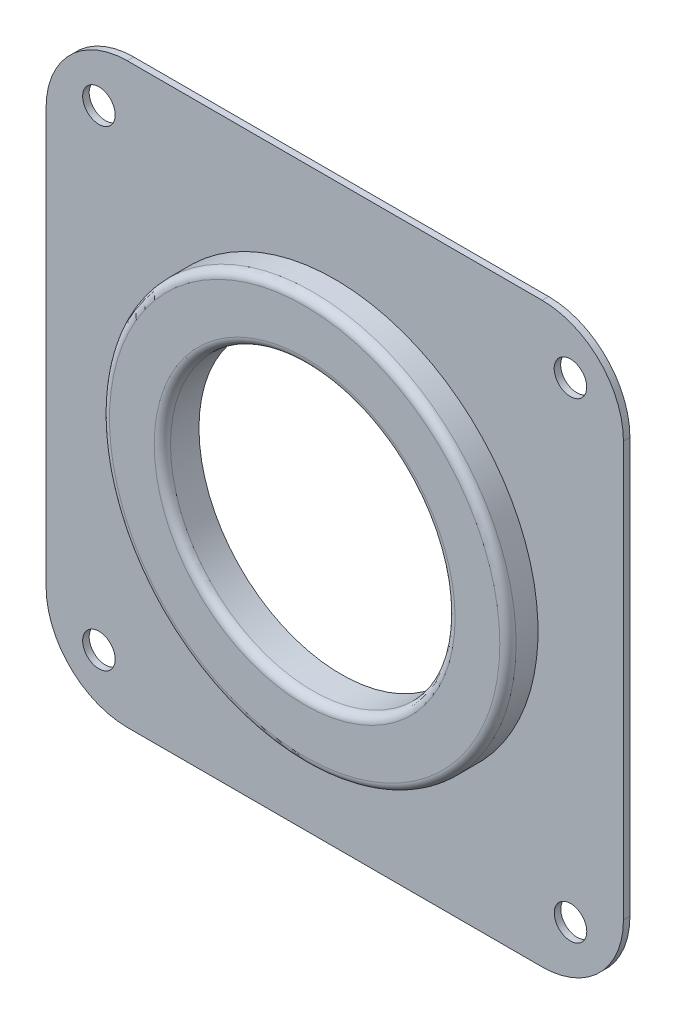
ISO-10303-21;
HEADER;
FILE_DESCRIPTION(('STEP AP214'),'2;1');
FILE_NAME('part.step','',(''),(''),'','','');
FILE_SCHEMA(('AUTOMOTIVE_DESIGN { 1 0 10303 214 1 1 1 1 }'));
ENDSEC;
DATA;
#1=APPLICATION_CONTEXT('core data for automotive mechanical design processes');
#2=APPLICATION_PROTOCOL_DEFINITION('international standard','automotive_design',2000,#1);
#3=PRODUCT_CONTEXT('',#1,'mechanical');
#4=PRODUCT('Part','Part','',(#3));
#5=PRODUCT_RELATED_PRODUCT_CATEGORY('part','',(#4));
#6=PRODUCT_DEFINITION_FORMATION('','',#4);
#7=PRODUCT_DEFINITION_CONTEXT('part definition',#1,'design');
#8=PRODUCT_DEFINITION('design','',#6,#7);
#9=PRODUCT_DEFINITION_SHAPE('','',#8);
#10=(LENGTH_UNIT() NAMED_UNIT(*) SI_UNIT(.MILLI.,.METRE.));
#11=(NAMED_UNIT(*) PLANE_ANGLE_UNIT() SI_UNIT($,.RADIAN.));
#12=(NAMED_UNIT(*) SI_UNIT($,.STERADIAN.) SOLID_ANGLE_UNIT());
#13=UNCERTAINTY_MEASURE_WITH_UNIT(LENGTH_MEASURE(1.E-05),#10,'distance_accuracy_value','');
#14=(GEOMETRIC_REPRESENTATION_CONTEXT(3) GLOBAL_UNCERTAINTY_ASSIGNED_CONTEXT((#13)) GLOBAL_UNIT_ASSIGNED_CONTEXT((#10,
#11,#12)) REPRESENTATION_CONTEXT('',''));
#15=CARTESIAN_POINT('',(0.,0.,0.));
#16=DIRECTION('',(0.,0.,1.));
#17=DIRECTION('',(1.,0.,0.));
#18=AXIS2_PLACEMENT_3D('',#15,#16,#17);
#19=CARTESIAN_POINT('',(35.5,35.5,0.2));
#20=DIRECTION('',(0.,1.,0.));
#21=DIRECTION('',(0.,0.,1.));
#22=AXIS2_PLACEMENT_3D('',#19,#20,#21);
#23=PLANE('',#22);
#24=DIRECTION('',(-1.,0.,0.));
#25=VECTOR('',#24,1.);
#26=CARTESIAN_POINT('',(35.5,35.5,0.2));
#27=LINE('',#26,#25);
#28=CARTESIAN_POINT('',(25.5,35.5,0.2));
#29=VERTEX_POINT('',#28);
#30=CARTESIAN_POINT('',(-25.5,35.5,0.2));
#31=VERTEX_POINT('',#30);
#32=EDGE_CURVE('E154',#29,#31,#27,.T.);
#33=ORIENTED_EDGE('',*,*,#32,.T.);
#34=DIRECTION('',(0.,0.,1.));
#35=VECTOR('',#34,1.);
#36=CARTESIAN_POINT('',(-25.5,35.5,0.2));
#37=LINE('',#36,#35);
#38=CARTESIAN_POINT('',(-25.5,35.5,1.));
#39=VERTEX_POINT('',#38);
#40=EDGE_CURVE('E11',#31,#39,#37,.T.);
#41=ORIENTED_EDGE('',*,*,#40,.T.);
#42=DIRECTION('',(-1.,0.,0.));
#43=VECTOR('',#42,1.);
#44=CARTESIAN_POINT('',(35.5,35.5,1.));
#45=LINE('',#44,#43);
#46=CARTESIAN_POINT('',(25.5,35.5,1.));
#47=VERTEX_POINT('',#46);
#48=EDGE_CURVE('E157',#47,#39,#45,.T.);
#49=ORIENTED_EDGE('',*,*,#48,.F.);
#50=DIRECTION('',(0.,0.,1.));
#51=VECTOR('',#50,1.);
#52=CARTESIAN_POINT('',(25.5,35.5,0.2));
#53=LINE('',#52,#51);
#54=EDGE_CURVE('E42',#47,#29,#53,.F.);
#55=ORIENTED_EDGE('',*,*,#54,.T.);
#56=EDGE_LOOP('',(#33,#41,#49,#55));
#57=FACE_BOUND('',#56,.T.);
#58=ADVANCED_FACE('F34',(#57),#23,.T.);
#59=CARTESIAN_POINT('',(35.5,-35.5,0.2));
#60=DIRECTION('',(1.,0.,0.));
#61=DIRECTION('',(0.,0.,-1.));
#62=AXIS2_PLACEMENT_3D('',#59,#60,#61);
#63=PLANE('',#62);
#64=DIRECTION('',(0.,1.,0.));
#65=VECTOR('',#64,1.);
#66=CARTESIAN_POINT('',(35.5,-35.5,1.));
#67=LINE('',#66,#65);
#68=CARTESIAN_POINT('',(35.5,-25.5,1.));
#69=VERTEX_POINT('',#68);
#70=CARTESIAN_POINT('',(35.5,25.5,1.));
#71=VERTEX_POINT('',#70);
#72=EDGE_CURVE('E120',#69,#71,#67,.T.);
#73=ORIENTED_EDGE('',*,*,#72,.F.);
#74=DIRECTION('',(0.,0.,1.));
#75=VECTOR('',#74,1.);
#76=CARTESIAN_POINT('',(35.5,-25.5,0.2));
#77=LINE('',#76,#75);
#78=CARTESIAN_POINT('',(35.5,-25.5,0.2));
#79=VERTEX_POINT('',#78);
#80=EDGE_CURVE('E138',#69,#79,#77,.F.);
#81=ORIENTED_EDGE('',*,*,#80,.T.);
#82=DIRECTION('',(0.,1.,0.));
#83=VECTOR('',#82,1.);
#84=CARTESIAN_POINT('',(35.5,-35.5,0.2));
#85=LINE('',#84,#83);
#86=CARTESIAN_POINT('',(35.5,25.5,0.2));
#87=VERTEX_POINT('',#86);
#88=EDGE_CURVE('E172',#79,#87,#85,.T.);
#89=ORIENTED_EDGE('',*,*,#88,.T.);
#90=DIRECTION('',(0.,0.,1.));
#91=VECTOR('',#90,1.);
#92=CARTESIAN_POINT('',(35.5,25.5,0.2));
#93=LINE('',#92,#91);
#94=EDGE_CURVE('E135',#87,#71,#93,.T.);
#95=ORIENTED_EDGE('',*,*,#94,.T.);
#96=EDGE_LOOP('',(#73,#81,#89,#95));
#97=FACE_BOUND('',#96,.T.);
#98=ADVANCED_FACE('F170',(#97),#63,.T.);
#99=CARTESIAN_POINT('',(-35.5,-35.5,0.2));
#100=DIRECTION('',(0.,-1.,0.));
#101=DIRECTION('',(1.,0.,0.));
#102=AXIS2_PLACEMENT_3D('',#99,#100,#101);
#103=PLANE('',#102);
#104=DIRECTION('',(1.,0.,0.));
#105=VECTOR('',#104,1.);
#106=CARTESIAN_POINT('',(-35.5,-35.5,0.2));
#107=LINE('',#106,#105);
#108=CARTESIAN_POINT('',(-25.5,-35.5,0.2));
#109=VERTEX_POINT('',#108);
#110=CARTESIAN_POINT('',(25.5,-35.5,0.2));
#111=VERTEX_POINT('',#110);
#112=EDGE_CURVE('E215',#109,#111,#107,.T.);
#113=ORIENTED_EDGE('',*,*,#112,.T.);
#114=DIRECTION('',(0.,0.,1.));
#115=VECTOR('',#114,1.);
#116=CARTESIAN_POINT('',(25.5,-35.5,0.2));
#117=LINE('',#116,#115);
#118=CARTESIAN_POINT('',(25.5,-35.5,1.));
#119=VERTEX_POINT('',#118);
#120=EDGE_CURVE('E119',#111,#119,#117,.T.);
#121=ORIENTED_EDGE('',*,*,#120,.T.);
#122=DIRECTION('',(1.,0.,0.));
#123=VECTOR('',#122,1.);
#124=CARTESIAN_POINT('',(-35.5,-35.5,1.));
#125=LINE('',#124,#123);
#126=CARTESIAN_POINT('',(-25.5,-35.5,1.));
#127=VERTEX_POINT('',#126);
#128=EDGE_CURVE('E104',#127,#119,#125,.T.);
#129=ORIENTED_EDGE('',*,*,#128,.F.);
#130=DIRECTION('',(0.,0.,1.));
#131=VECTOR('',#130,1.);
#132=CARTESIAN_POINT('',(-25.5,-35.5,0.2));
#133=LINE('',#132,#131);
#134=EDGE_CURVE('E117',#127,#109,#133,.F.);
#135=ORIENTED_EDGE('',*,*,#134,.T.);
#136=EDGE_LOOP('',(#113,#121,#129,#135));
#137=FACE_BOUND('',#136,.T.);
#138=ADVANCED_FACE('F116',(#137),#103,.T.);
#139=CARTESIAN_POINT('',(-35.5,35.5,0.2));
#140=DIRECTION('',(-1.,0.,0.));
#141=DIRECTION('',(0.,0.,1.));
#142=AXIS2_PLACEMENT_3D('',#139,#140,#141);
#143=PLANE('',#142);
#144=DIRECTION('',(0.,-1.,0.));
#145=VECTOR('',#144,1.);
#146=CARTESIAN_POINT('',(-35.5,35.5,0.2));
#147=LINE('',#146,#145);
#148=CARTESIAN_POINT('',(-35.5,25.5,0.2));
#149=VERTEX_POINT('',#148);
#150=CARTESIAN_POINT('',(-35.5,-25.5,0.2));
#151=VERTEX_POINT('',#150);
#152=EDGE_CURVE('E164',#149,#151,#147,.T.);
#153=ORIENTED_EDGE('',*,*,#152,.T.);
#154=DIRECTION('',(0.,0.,1.));
#155=VECTOR('',#154,1.);
#156=CARTESIAN_POINT('',(-35.5,-25.5,0.2));
#157=LINE('',#156,#155);
#158=CARTESIAN_POINT('',(-35.5,-25.5,1.));
#159=VERTEX_POINT('',#158);
#160=EDGE_CURVE('E148',#151,#159,#157,.T.);
#161=ORIENTED_EDGE('',*,*,#160,.T.);
#162=DIRECTION('',(0.,-1.,0.));
#163=VECTOR('',#162,1.);
#164=CARTESIAN_POINT('',(-35.5,35.5,1.));
#165=LINE('',#164,#163);
#166=CARTESIAN_POINT('',(-35.5,25.5,1.));
#167=VERTEX_POINT('',#166);
#168=EDGE_CURVE('E105',#167,#159,#165,.T.);
#169=ORIENTED_EDGE('',*,*,#168,.F.);
#170=DIRECTION('',(0.,0.,1.));
#171=VECTOR('',#170,1.);
#172=CARTESIAN_POINT('',(-35.5,25.5,0.2));
#173=LINE('',#172,#171);
#174=EDGE_CURVE('E56',#167,#149,#173,.F.);
#175=ORIENTED_EDGE('',*,*,#174,.T.);
#176=EDGE_LOOP('',(#153,#161,#169,#175));
#177=FACE_BOUND('',#176,.T.);
#178=ADVANCED_FACE('F219',(#177),#143,.T.);
#179=CARTESIAN_POINT('',(0.,0.,0.2));
#180=DIRECTION('',(0.,0.,1.));
#181=DIRECTION('',(1.,0.,0.));
#182=AXIS2_PLACEMENT_3D('',#179,#180,#181);
#183=PLANE('',#182);
#184=CARTESIAN_POINT('',(-29.,28.98,0.2));
#185=DIRECTION('',(0.,0.,1.));
#186=DIRECTION('',(1.,0.,0.));
#187=AXIS2_PLACEMENT_3D('',#184,#185,#186);
#188=CIRCLE('',#187,2.);
#189=CARTESIAN_POINT('',(-27.,28.98,0.2));
#190=VERTEX_POINT('',#189);
#191=EDGE_CURVE('E384',#190,#190,#188,.T.);
#192=ORIENTED_EDGE('',*,*,#191,.T.);
#193=EDGE_LOOP('',(#192));
#194=FACE_BOUND('',#193,.T.);
#195=CARTESIAN_POINT('',(-29.,-29.,0.2));
#196=DIRECTION('',(0.,0.,1.));
#197=DIRECTION('',(1.,0.,0.));
#198=AXIS2_PLACEMENT_3D('',#195,#196,#197);
#199=CIRCLE('',#198,2.);
#200=CARTESIAN_POINT('',(-27.,-29.,0.2));
#201=VERTEX_POINT('',#200);
#202=EDGE_CURVE('E388',#201,#201,#199,.T.);
#203=ORIENTED_EDGE('',*,*,#202,.T.);
#204=EDGE_LOOP('',(#203));
#205=FACE_BOUND('',#204,.T.);
#206=CARTESIAN_POINT('',(28.9927539458673,-28.9927564445067,0.2));
#207=DIRECTION('',(0.,0.,1.));
#208=DIRECTION('',(1.,0.,0.));
#209=AXIS2_PLACEMENT_3D('',#206,#207,#208);
#210=CIRCLE('',#209,2.);
#211=CARTESIAN_POINT('',(30.9927539458673,-28.9927564445067,0.2));
#212=VERTEX_POINT('',#211);
#213=EDGE_CURVE('E392',#212,#212,#210,.T.);
#214=ORIENTED_EDGE('',*,*,#213,.T.);
#215=EDGE_LOOP('',(#214));
#216=FACE_BOUND('',#215,.T.);
#217=CARTESIAN_POINT('',(28.9827560572969,28.9827560572969,0.2));
#218=DIRECTION('',(0.,0.,1.));
#219=DIRECTION('',(1.,0.,0.));
#220=AXIS2_PLACEMENT_3D('',#217,#218,#219);
#221=CIRCLE('',#220,2.);
#222=CARTESIAN_POINT('',(30.9827560572969,28.9827560572969,0.2));
#223=VERTEX_POINT('',#222);
#224=EDGE_CURVE('E205',#223,#223,#221,.T.);
#225=ORIENTED_EDGE('',*,*,#224,.T.);
#226=EDGE_LOOP('',(#225));
#227=FACE_BOUND('',#226,.T.);
#228=CARTESIAN_POINT('',(0.,0.,0.200000000000002));
#229=DIRECTION('',(0.,0.,1.));
#230=DIRECTION('',(1.,0.,0.));
#231=AXIS2_PLACEMENT_3D('',#228,#229,#230);
#232=CIRCLE('',#231,17.5);
#233=CARTESIAN_POINT('',(17.5,0.,0.200000000000002));
#234=VERTEX_POINT('',#233);
#235=EDGE_CURVE('E202',#234,#234,#232,.T.);
#236=ORIENTED_EDGE('',*,*,#235,.T.);
#237=EDGE_LOOP('',(#236));
#238=FACE_BOUND('',#237,.T.);
#239=ORIENTED_EDGE('',*,*,#88,.F.);
#240=CARTESIAN_POINT('',(25.5,-25.5,0.2));
#241=DIRECTION('',(0.,0.,1.));
#242=DIRECTION('',(1.,0.,0.));
#243=AXIS2_PLACEMENT_3D('',#240,#241,#242);
#244=CIRCLE('',#243,10.);
#245=EDGE_CURVE('E145',#79,#111,#244,.F.);
#246=ORIENTED_EDGE('',*,*,#245,.T.);
#247=ORIENTED_EDGE('',*,*,#112,.F.);
#248=CARTESIAN_POINT('',(-25.5,-25.5,0.2));
#249=DIRECTION('',(0.,0.,1.));
#250=DIRECTION('',(1.,0.,0.));
#251=AXIS2_PLACEMENT_3D('',#248,#249,#250);
#252=CIRCLE('',#251,10.);
#253=EDGE_CURVE('E49',#109,#151,#252,.F.);
#254=ORIENTED_EDGE('',*,*,#253,.T.);
#255=ORIENTED_EDGE('',*,*,#152,.F.);
#256=CARTESIAN_POINT('',(-25.5,25.5,0.2));
#257=DIRECTION('',(0.,0.,1.));
#258=DIRECTION('',(1.,0.,0.));
#259=AXIS2_PLACEMENT_3D('',#256,#257,#258);
#260=CIRCLE('',#259,10.);
#261=EDGE_CURVE('E142',#149,#31,#260,.F.);
#262=ORIENTED_EDGE('',*,*,#261,.T.);
#263=ORIENTED_EDGE('',*,*,#32,.F.);
#264=CARTESIAN_POINT('',(25.5,25.5,0.2));
#265=DIRECTION('',(0.,0.,1.));
#266=DIRECTION('',(1.,0.,0.));
#267=AXIS2_PLACEMENT_3D('',#264,#265,#266);
#268=CIRCLE('',#267,10.);
#269=EDGE_CURVE('E140',#29,#87,#268,.F.);
#270=ORIENTED_EDGE('',*,*,#269,.T.);
#271=EDGE_LOOP('',(#239,#246,#247,#254,#255,#262,#263,#270));
#272=FACE_BOUND('',#271,.T.);
#273=ADVANCED_FACE('F161',(#194,#205,#216,#227,#238,#272),#183,.F.);
#274=CARTESIAN_POINT('',(0.,0.,1.));
#275=DIRECTION('',(0.,0.,1.));
#276=DIRECTION('',(1.,0.,0.));
#277=AXIS2_PLACEMENT_3D('',#274,#275,#276);
#278=PLANE('',#277);
#279=CARTESIAN_POINT('',(-29.,28.98,1.));
#280=DIRECTION('',(0.,0.,1.));
#281=DIRECTION('',(1.,0.,0.));
#282=AXIS2_PLACEMENT_3D('',#279,#280,#281);
#283=CIRCLE('',#282,1.99999999999999);
#284=CARTESIAN_POINT('',(-27.,28.98,1.));
#285=VERTEX_POINT('',#284);
#286=EDGE_CURVE('E408',#285,#285,#283,.T.);
#287=ORIENTED_EDGE('',*,*,#286,.F.);
#288=EDGE_LOOP('',(#287));
#289=FACE_BOUND('',#288,.T.);
#290=CARTESIAN_POINT('',(-29.,-29.,1.));
#291=DIRECTION('',(0.,0.,1.));
#292=DIRECTION('',(1.,0.,0.));
#293=AXIS2_PLACEMENT_3D('',#290,#291,#292);
#294=CIRCLE('',#293,1.99999999999999);
#295=CARTESIAN_POINT('',(-27.,-29.,1.));
#296=VERTEX_POINT('',#295);
#297=EDGE_CURVE('E404',#296,#296,#294,.T.);
#298=ORIENTED_EDGE('',*,*,#297,.F.);
#299=EDGE_LOOP('',(#298));
#300=FACE_BOUND('',#299,.T.);
#301=CARTESIAN_POINT('',(28.9927539458673,-28.9927564445067,1.));
#302=DIRECTION('',(0.,0.,1.));
#303=DIRECTION('',(1.,0.,0.));
#304=AXIS2_PLACEMENT_3D('',#301,#302,#303);
#305=CIRCLE('',#304,1.99999999999999);
#306=CARTESIAN_POINT('',(30.9927539458673,-28.9927564445067,1.));
#307=VERTEX_POINT('',#306);
#308=EDGE_CURVE('E398',#307,#307,#305,.T.);
#309=ORIENTED_EDGE('',*,*,#308,.F.);
#310=EDGE_LOOP('',(#309));
#311=FACE_BOUND('',#310,.T.);
#312=CARTESIAN_POINT('',(28.9827560572969,28.9827560572969,1.));
#313=DIRECTION('',(0.,0.,1.));
#314=DIRECTION('',(1.,0.,0.));
#315=AXIS2_PLACEMENT_3D('',#312,#313,#314);
#316=CIRCLE('',#315,1.99999999999999);
#317=CARTESIAN_POINT('',(30.9827560572969,28.9827560572969,1.));
#318=VERTEX_POINT('',#317);
#319=EDGE_CURVE('E210',#318,#318,#316,.T.);
#320=ORIENTED_EDGE('',*,*,#319,.F.);
#321=EDGE_LOOP('',(#320));
#322=FACE_BOUND('',#321,.T.);
#323=CARTESIAN_POINT('',(0.,0.,1.));
#324=DIRECTION('',(0.,0.,-1.));
#325=DIRECTION('',(-1.,0.,0.));
#326=AXIS2_PLACEMENT_3D('',#323,#324,#325);
#327=CIRCLE('',#326,25.);
#328=CARTESIAN_POINT('',(-25.,0.,1.));
#329=VERTEX_POINT('',#328);
#330=EDGE_CURVE('E204',#329,#329,#327,.T.);
#331=ORIENTED_EDGE('',*,*,#330,.T.);
#332=EDGE_LOOP('',(#331));
#333=FACE_BOUND('',#332,.T.);
#334=ORIENTED_EDGE('',*,*,#128,.T.);
#335=CARTESIAN_POINT('',(25.5,-25.5,1.));
#336=DIRECTION('',(0.,0.,1.));
#337=DIRECTION('',(1.,0.,0.));
#338=AXIS2_PLACEMENT_3D('',#335,#336,#337);
#339=CIRCLE('',#338,10.);
#340=EDGE_CURVE('E110',#119,#69,#339,.T.);
#341=ORIENTED_EDGE('',*,*,#340,.T.);
#342=ORIENTED_EDGE('',*,*,#72,.T.);
#343=CARTESIAN_POINT('',(25.5,25.5,1.));
#344=DIRECTION('',(0.,0.,1.));
#345=DIRECTION('',(1.,0.,0.));
#346=AXIS2_PLACEMENT_3D('',#343,#344,#345);
#347=CIRCLE('',#346,10.);
#348=EDGE_CURVE('E125',#71,#47,#347,.T.);
#349=ORIENTED_EDGE('',*,*,#348,.T.);
#350=ORIENTED_EDGE('',*,*,#48,.T.);
#351=CARTESIAN_POINT('',(-25.5,25.5,1.));
#352=DIRECTION('',(0.,0.,1.));
#353=DIRECTION('',(1.,0.,0.));
#354=AXIS2_PLACEMENT_3D('',#351,#352,#353);
#355=CIRCLE('',#354,10.);
#356=EDGE_CURVE('E111',#39,#167,#355,.T.);
#357=ORIENTED_EDGE('',*,*,#356,.T.);
#358=ORIENTED_EDGE('',*,*,#168,.T.);
#359=CARTESIAN_POINT('',(-25.5,-25.5,1.));
#360=DIRECTION('',(0.,0.,1.));
#361=DIRECTION('',(1.,0.,0.));
#362=AXIS2_PLACEMENT_3D('',#359,#360,#361);
#363=CIRCLE('',#362,10.);
#364=EDGE_CURVE('E101',#159,#127,#363,.T.);
#365=ORIENTED_EDGE('',*,*,#364,.T.);
#366=EDGE_LOOP('',(#334,#341,#342,#349,#350,#357,#358,#365));
#367=FACE_BOUND('',#366,.T.);
#368=ADVANCED_FACE('F103',(#289,#300,#311,#322,#333,#367),#278,.T.);
#369=CARTESIAN_POINT('',(0.,0.,4.7));
#370=DIRECTION('',(0.,0.,-1.));
#371=DIRECTION('',(-1.,0.,0.));
#372=AXIS2_PLACEMENT_3D('',#369,#370,#371);
#373=CYLINDRICAL_SURFACE('',#372,25.);
#374=CARTESIAN_POINT('',(0.,0.,3.7));
#375=DIRECTION('',(0.,0.,1.));
#376=DIRECTION('',(1.,0.,0.));
#377=AXIS2_PLACEMENT_3D('',#374,#375,#376);
#378=CIRCLE('',#377,25.);
#379=CARTESIAN_POINT('',(25.,0.,3.7));
#380=VERTEX_POINT('',#379);
#381=EDGE_CURVE('E123',#380,#380,#378,.F.);
#382=ORIENTED_EDGE('',*,*,#381,.T.);
#383=EDGE_LOOP('',(#382));
#384=FACE_BOUND('',#383,.T.);
#385=ORIENTED_EDGE('',*,*,#330,.F.);
#386=EDGE_LOOP('',(#385));
#387=FACE_BOUND('',#386,.T.);
#388=ADVANCED_FACE('F323',(#384,#387),#373,.T.);
#389=CARTESIAN_POINT('',(25.,0.,4.7));
#390=DIRECTION('',(0.,0.,1.));
#391=DIRECTION('',(1.,0.,0.));
#392=AXIS2_PLACEMENT_3D('',#389,#390,#391);
#393=PLANE('',#392);
#394=CARTESIAN_POINT('',(0.,0.,4.7));
#395=DIRECTION('',(0.,0.,1.));
#396=DIRECTION('',(1.,0.,0.));
#397=AXIS2_PLACEMENT_3D('',#394,#395,#396);
#398=CIRCLE('',#397,18.5);
#399=CARTESIAN_POINT('',(18.5,0.,4.7));
#400=VERTEX_POINT('',#399);
#401=EDGE_CURVE('E128',#400,#400,#398,.F.);
#402=ORIENTED_EDGE('',*,*,#401,.T.);
#403=EDGE_LOOP('',(#402));
#404=FACE_BOUND('',#403,.T.);
#405=CARTESIAN_POINT('',(0.,0.,4.7));
#406=DIRECTION('',(0.,0.,1.));
#407=DIRECTION('',(1.,0.,0.));
#408=AXIS2_PLACEMENT_3D('',#405,#406,#407);
#409=CIRCLE('',#408,24.);
#410=CARTESIAN_POINT('',(24.,0.,4.7));
#411=VERTEX_POINT('',#410);
#412=EDGE_CURVE('E179',#411,#411,#409,.T.);
#413=ORIENTED_EDGE('',*,*,#412,.T.);
#414=EDGE_LOOP('',(#413));
#415=FACE_BOUND('',#414,.T.);
#416=ADVANCED_FACE('F184',(#404,#415),#393,.T.);
#417=CARTESIAN_POINT('',(0.,0.,4.7));
#418=DIRECTION('',(0.,0.,1.));
#419=DIRECTION('',(1.,0.,0.));
#420=AXIS2_PLACEMENT_3D('',#417,#418,#419);
#421=CYLINDRICAL_SURFACE('',#420,17.5);
#422=CARTESIAN_POINT('',(0.,0.,3.7));
#423=DIRECTION('',(0.,0.,1.));
#424=DIRECTION('',(1.,0.,0.));
#425=AXIS2_PLACEMENT_3D('',#422,#423,#424);
#426=CIRCLE('',#425,17.5);
#427=CARTESIAN_POINT('',(17.5,0.,3.7));
#428=VERTEX_POINT('',#427);
#429=EDGE_CURVE('E176',#428,#428,#426,.T.);
#430=ORIENTED_EDGE('',*,*,#429,.T.);
#431=EDGE_LOOP('',(#430));
#432=FACE_BOUND('',#431,.T.);
#433=ORIENTED_EDGE('',*,*,#235,.F.);
#434=EDGE_LOOP('',(#433));
#435=FACE_BOUND('',#434,.T.);
#436=ADVANCED_FACE('F195',(#432,#435),#421,.F.);
#437=CARTESIAN_POINT('',(28.9827560572969,28.9827560572969,1.));
#438=DIRECTION('',(0.,0.,1.));
#439=DIRECTION('',(1.,0.,0.));
#440=AXIS2_PLACEMENT_3D('',#437,#438,#439);
#441=CYLINDRICAL_SURFACE('',#440,1.99999999999999);
#442=ORIENTED_EDGE('',*,*,#224,.F.);
#443=EDGE_LOOP('',(#442));
#444=FACE_BOUND('',#443,.T.);
#445=ORIENTED_EDGE('',*,*,#319,.T.);
#446=EDGE_LOOP('',(#445));
#447=FACE_BOUND('',#446,.T.);
#448=ADVANCED_FACE('F198',(#444,#447),#441,.F.);
#449=CARTESIAN_POINT('',(28.9927539458673,-28.9927564445067,1.));
#450=DIRECTION('',(0.,0.,1.));
#451=DIRECTION('',(1.,0.,0.));
#452=AXIS2_PLACEMENT_3D('',#449,#450,#451);
#453=CYLINDRICAL_SURFACE('',#452,1.99999999999999);
#454=ORIENTED_EDGE('',*,*,#213,.F.);
#455=EDGE_LOOP('',(#454));
#456=FACE_BOUND('',#455,.T.);
#457=ORIENTED_EDGE('',*,*,#308,.T.);
#458=EDGE_LOOP('',(#457));
#459=FACE_BOUND('',#458,.T.);
#460=ADVANCED_FACE('F294',(#456,#459),#453,.F.);
#461=CARTESIAN_POINT('',(-29.,-29.,1.));
#462=DIRECTION('',(0.,0.,1.));
#463=DIRECTION('',(1.,0.,0.));
#464=AXIS2_PLACEMENT_3D('',#461,#462,#463);
#465=CYLINDRICAL_SURFACE('',#464,1.99999999999999);
#466=ORIENTED_EDGE('',*,*,#202,.F.);
#467=EDGE_LOOP('',(#466));
#468=FACE_BOUND('',#467,.T.);
#469=ORIENTED_EDGE('',*,*,#297,.T.);
#470=EDGE_LOOP('',(#469));
#471=FACE_BOUND('',#470,.T.);
#472=ADVANCED_FACE('F284',(#468,#471),#465,.F.);
#473=CARTESIAN_POINT('',(-29.,28.98,1.));
#474=DIRECTION('',(0.,0.,1.));
#475=DIRECTION('',(1.,0.,0.));
#476=AXIS2_PLACEMENT_3D('',#473,#474,#475);
#477=CYLINDRICAL_SURFACE('',#476,1.99999999999999);
#478=ORIENTED_EDGE('',*,*,#191,.F.);
#479=EDGE_LOOP('',(#478));
#480=FACE_BOUND('',#479,.T.);
#481=ORIENTED_EDGE('',*,*,#286,.T.);
#482=EDGE_LOOP('',(#481));
#483=FACE_BOUND('',#482,.T.);
#484=ADVANCED_FACE('F191',(#480,#483),#477,.F.);
#485=CARTESIAN_POINT('',(0.,0.,3.7));
#486=DIRECTION('',(0.,0.,1.));
#487=DIRECTION('',(1.,0.,0.));
#488=AXIS2_PLACEMENT_3D('',#485,#486,#487);
#489=TOROIDAL_SURFACE('',#488,18.5,1.);
#490=ORIENTED_EDGE('',*,*,#401,.F.);
#491=EDGE_LOOP('',(#490));
#492=FACE_BOUND('',#491,.T.);
#493=ORIENTED_EDGE('',*,*,#429,.F.);
#494=EDGE_LOOP('',(#493));
#495=FACE_BOUND('',#494,.T.);
#496=ADVANCED_FACE('F187',(#492,#495),#489,.T.);
#497=CARTESIAN_POINT('',(0.,0.,3.7));
#498=DIRECTION('',(0.,0.,1.));
#499=DIRECTION('',(1.,0.,0.));
#500=AXIS2_PLACEMENT_3D('',#497,#498,#499);
#501=TOROIDAL_SURFACE('',#500,24.,1.);
#502=ORIENTED_EDGE('',*,*,#412,.F.);
#503=EDGE_LOOP('',(#502));
#504=FACE_BOUND('',#503,.T.);
#505=ORIENTED_EDGE('',*,*,#381,.F.);
#506=EDGE_LOOP('',(#505));
#507=FACE_BOUND('',#506,.T.);
#508=ADVANCED_FACE('F190',(#504,#507),#501,.T.);
#509=CARTESIAN_POINT('',(25.5,-25.5,0.2));
#510=DIRECTION('',(0.,0.,1.));
#511=DIRECTION('',(1.,0.,0.));
#512=AXIS2_PLACEMENT_3D('',#509,#510,#511);
#513=CYLINDRICAL_SURFACE('',#512,10.);
#514=ORIENTED_EDGE('',*,*,#245,.F.);
#515=ORIENTED_EDGE('',*,*,#80,.F.);
#516=ORIENTED_EDGE('',*,*,#340,.F.);
#517=ORIENTED_EDGE('',*,*,#120,.F.);
#518=EDGE_LOOP('',(#514,#515,#516,#517));
#519=FACE_BOUND('',#518,.T.);
#520=ADVANCED_FACE('F226',(#519),#513,.T.);
#521=CARTESIAN_POINT('',(-25.5,-25.5,0.2));
#522=DIRECTION('',(0.,0.,1.));
#523=DIRECTION('',(1.,0.,0.));
#524=AXIS2_PLACEMENT_3D('',#521,#522,#523);
#525=CYLINDRICAL_SURFACE('',#524,10.);
#526=ORIENTED_EDGE('',*,*,#253,.F.);
#527=ORIENTED_EDGE('',*,*,#134,.F.);
#528=ORIENTED_EDGE('',*,*,#364,.F.);
#529=ORIENTED_EDGE('',*,*,#160,.F.);
#530=EDGE_LOOP('',(#526,#527,#528,#529));
#531=FACE_BOUND('',#530,.T.);
#532=ADVANCED_FACE('F122',(#531),#525,.T.);
#533=CARTESIAN_POINT('',(-25.5,25.5,0.2));
#534=DIRECTION('',(0.,0.,1.));
#535=DIRECTION('',(1.,0.,0.));
#536=AXIS2_PLACEMENT_3D('',#533,#534,#535);
#537=CYLINDRICAL_SURFACE('',#536,10.);
#538=ORIENTED_EDGE('',*,*,#261,.F.);
#539=ORIENTED_EDGE('',*,*,#174,.F.);
#540=ORIENTED_EDGE('',*,*,#356,.F.);
#541=ORIENTED_EDGE('',*,*,#40,.F.);
#542=EDGE_LOOP('',(#538,#539,#540,#541));
#543=FACE_BOUND('',#542,.T.);
#544=ADVANCED_FACE('F220',(#543),#537,.T.);
#545=CARTESIAN_POINT('',(25.5,25.5,0.2));
#546=DIRECTION('',(0.,0.,1.));
#547=DIRECTION('',(1.,0.,0.));
#548=AXIS2_PLACEMENT_3D('',#545,#546,#547);
#549=CYLINDRICAL_SURFACE('',#548,10.);
#550=ORIENTED_EDGE('',*,*,#269,.F.);
#551=ORIENTED_EDGE('',*,*,#54,.F.);
#552=ORIENTED_EDGE('',*,*,#348,.F.);
#553=ORIENTED_EDGE('',*,*,#94,.F.);
#554=EDGE_LOOP('',(#550,#551,#552,#553));
#555=FACE_BOUND('',#554,.T.);
#556=ADVANCED_FACE('F36',(#555),#549,.T.);
#557=CLOSED_SHELL('',(#58,#98,#138,#178,#273,#368,#388,#416,#436,#448,#460,#472,#484,#496,#508,
#520,#532,#544,#556));
#558=MANIFOLD_SOLID_BREP('B2',#557);
#559=ADVANCED_BREP_SHAPE_REPRESENTATION('',(#18,#558),#14);
#560=SHAPE_DEFINITION_REPRESENTATION(#9,#559);
ENDSEC;
END-ISO-10303-21;
